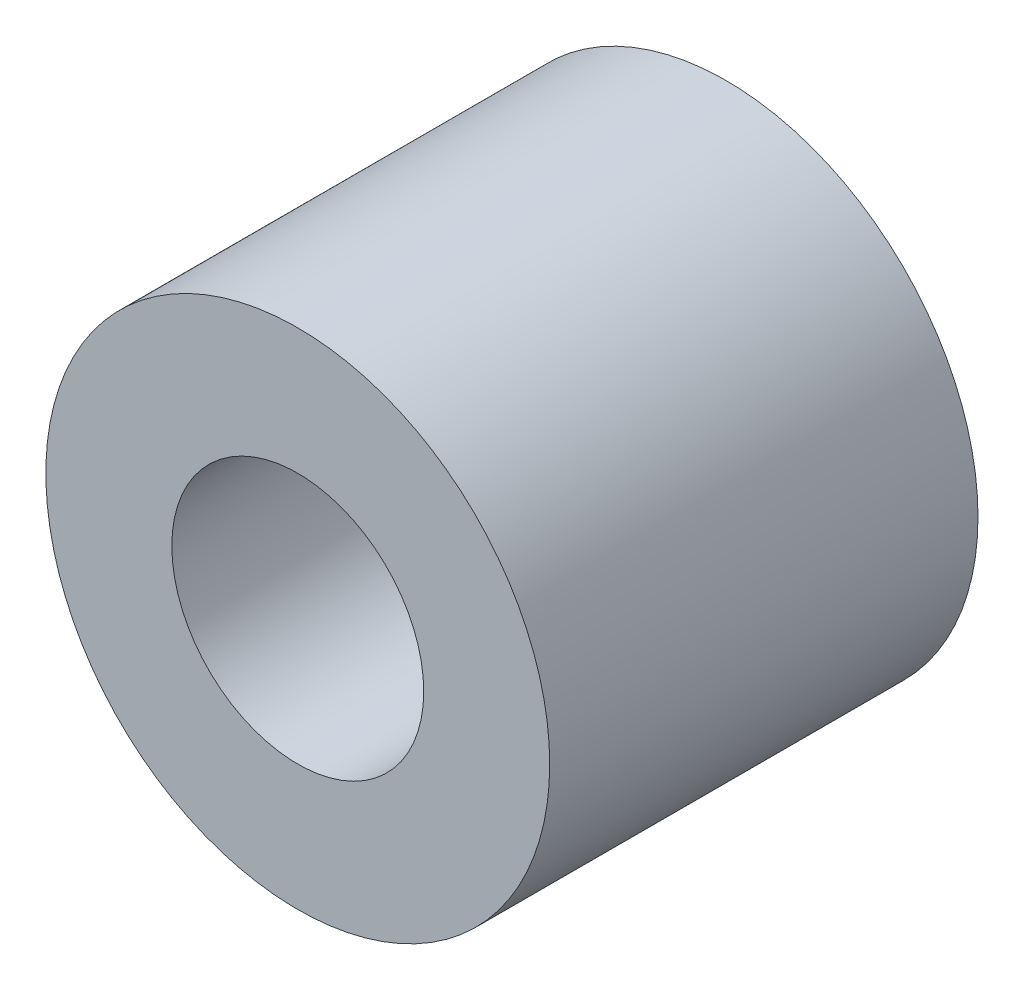
ISO-10303-21;
HEADER;
FILE_DESCRIPTION(('STEP AP214'),'2;1');
FILE_NAME('part.step','',(''),(''),'','','');
FILE_SCHEMA(('AUTOMOTIVE_DESIGN { 1 0 10303 214 1 1 1 1 }'));
ENDSEC;
DATA;
#1=APPLICATION_CONTEXT('core data for automotive mechanical design processes');
#2=APPLICATION_PROTOCOL_DEFINITION('international standard','automotive_design',2000,#1);
#3=PRODUCT_CONTEXT('',#1,'mechanical');
#4=PRODUCT('Part','Part','',(#3));
#5=PRODUCT_RELATED_PRODUCT_CATEGORY('part','',(#4));
#6=PRODUCT_DEFINITION_FORMATION('','',#4);
#7=PRODUCT_DEFINITION_CONTEXT('part definition',#1,'design');
#8=PRODUCT_DEFINITION('design','',#6,#7);
#9=PRODUCT_DEFINITION_SHAPE('','',#8);
#10=(LENGTH_UNIT() NAMED_UNIT(*) SI_UNIT(.MILLI.,.METRE.));
#11=(NAMED_UNIT(*) PLANE_ANGLE_UNIT() SI_UNIT($,.RADIAN.));
#12=(NAMED_UNIT(*) SI_UNIT($,.STERADIAN.) SOLID_ANGLE_UNIT());
#13=UNCERTAINTY_MEASURE_WITH_UNIT(LENGTH_MEASURE(1.E-05),#10,'distance_accuracy_value','');
#14=(GEOMETRIC_REPRESENTATION_CONTEXT(3) GLOBAL_UNCERTAINTY_ASSIGNED_CONTEXT((#13)) GLOBAL_UNIT_ASSIGNED_CONTEXT((#10,
#11,#12)) REPRESENTATION_CONTEXT('',''));
#15=CARTESIAN_POINT('',(0.,0.,0.));
#16=DIRECTION('',(0.,0.,1.));
#17=DIRECTION('',(1.,0.,0.));
#18=AXIS2_PLACEMENT_3D('',#15,#16,#17);
#19=CARTESIAN_POINT('',(0.,0.,8.5));
#20=DIRECTION('',(0.,0.,1.));
#21=DIRECTION('',(1.,0.,0.));
#22=AXIS2_PLACEMENT_3D('',#19,#20,#21);
#23=PLANE('',#22);
#24=CARTESIAN_POINT('',(0.,0.,8.5));
#25=DIRECTION('',(0.,0.,1.));
#26=DIRECTION('',(1.,0.,0.));
#27=AXIS2_PLACEMENT_3D('',#24,#25,#26);
#28=CIRCLE('',#27,5.);
#29=CARTESIAN_POINT('',(5.,0.,8.5));
#30=VERTEX_POINT('',#29);
#31=EDGE_CURVE('E10',#30,#30,#28,.T.);
#32=ORIENTED_EDGE('',*,*,#31,.T.);
#33=EDGE_LOOP('',(#32));
#34=FACE_BOUND('',#33,.T.);
#35=CARTESIAN_POINT('',(0.,0.,8.5));
#36=DIRECTION('',(0.,0.,1.));
#37=DIRECTION('',(1.,0.,0.));
#38=AXIS2_PLACEMENT_3D('',#35,#36,#37);
#39=CIRCLE('',#38,2.5);
#40=CARTESIAN_POINT('',(2.5,0.,8.5));
#41=VERTEX_POINT('',#40);
#42=EDGE_CURVE('E39',#41,#41,#39,.T.);
#43=ORIENTED_EDGE('',*,*,#42,.F.);
#44=EDGE_LOOP('',(#43));
#45=FACE_BOUND('',#44,.T.);
#46=ADVANCED_FACE('F28',(#34,#45),#23,.T.);
#47=CARTESIAN_POINT('',(0.,0.,0.));
#48=DIRECTION('',(0.,0.,1.));
#49=DIRECTION('',(1.,0.,0.));
#50=AXIS2_PLACEMENT_3D('',#47,#48,#49);
#51=PLANE('',#50);
#52=CARTESIAN_POINT('',(0.,0.,0.));
#53=DIRECTION('',(0.,0.,1.));
#54=DIRECTION('',(1.,0.,0.));
#55=AXIS2_PLACEMENT_3D('',#52,#53,#54);
#56=CIRCLE('',#55,5.);
#57=CARTESIAN_POINT('',(5.,0.,0.));
#58=VERTEX_POINT('',#57);
#59=EDGE_CURVE('E32',#58,#58,#56,.T.);
#60=ORIENTED_EDGE('',*,*,#59,.F.);
#61=EDGE_LOOP('',(#60));
#62=FACE_BOUND('',#61,.T.);
#63=CARTESIAN_POINT('',(0.,0.,0.));
#64=DIRECTION('',(0.,0.,1.));
#65=DIRECTION('',(1.,0.,0.));
#66=AXIS2_PLACEMENT_3D('',#63,#64,#65);
#67=CIRCLE('',#66,2.5);
#68=CARTESIAN_POINT('',(2.5,0.,0.));
#69=VERTEX_POINT('',#68);
#70=EDGE_CURVE('E41',#69,#69,#67,.T.);
#71=ORIENTED_EDGE('',*,*,#70,.T.);
#72=EDGE_LOOP('',(#71));
#73=FACE_BOUND('',#72,.T.);
#74=ADVANCED_FACE('F51',(#62,#73),#51,.F.);
#75=CARTESIAN_POINT('',(0.,0.,8.5));
#76=DIRECTION('',(0.,0.,-1.));
#77=DIRECTION('',(-1.,0.,0.));
#78=AXIS2_PLACEMENT_3D('',#75,#76,#77);
#79=CYLINDRICAL_SURFACE('',#78,5.);
#80=ORIENTED_EDGE('',*,*,#31,.F.);
#81=EDGE_LOOP('',(#80));
#82=FACE_BOUND('',#81,.T.);
#83=ORIENTED_EDGE('',*,*,#59,.T.);
#84=EDGE_LOOP('',(#83));
#85=FACE_BOUND('',#84,.T.);
#86=ADVANCED_FACE('F30',(#82,#85),#79,.T.);
#87=CARTESIAN_POINT('',(0.,0.,8.5));
#88=DIRECTION('',(0.,0.,-1.));
#89=DIRECTION('',(-1.,0.,0.));
#90=AXIS2_PLACEMENT_3D('',#87,#88,#89);
#91=CYLINDRICAL_SURFACE('',#90,2.5);
#92=ORIENTED_EDGE('',*,*,#42,.T.);
#93=EDGE_LOOP('',(#92));
#94=FACE_BOUND('',#93,.T.);
#95=ORIENTED_EDGE('',*,*,#70,.F.);
#96=EDGE_LOOP('',(#95));
#97=FACE_BOUND('',#96,.T.);
#98=ADVANCED_FACE('F47',(#94,#97),#91,.F.);
#99=CLOSED_SHELL('',(#46,#74,#86,#98));
#100=MANIFOLD_SOLID_BREP('B2',#99);
#101=ADVANCED_BREP_SHAPE_REPRESENTATION('',(#18,#100),#14);
#102=SHAPE_DEFINITION_REPRESENTATION(#9,#101);
ENDSEC;
END-ISO-10303-21;
